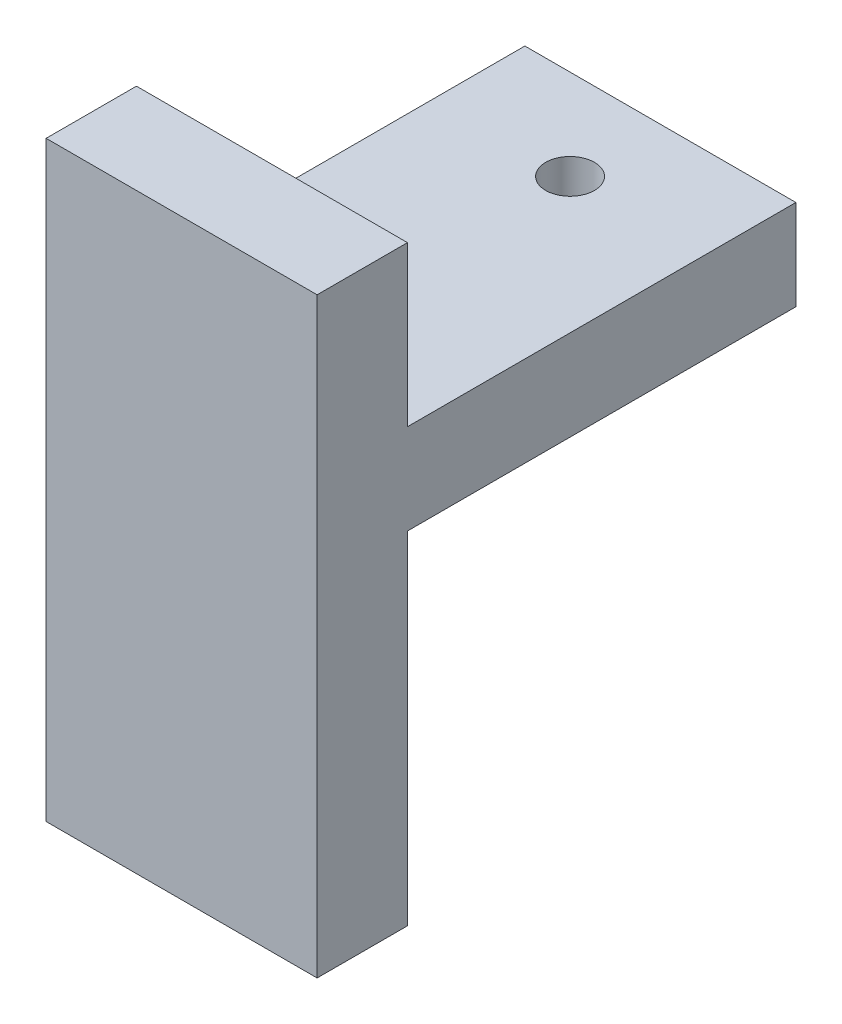
ISO-10303-21;
HEADER;
FILE_DESCRIPTION(('STEP AP214'),'2;1');
FILE_NAME('part.step','',(''),(''),'','','');
FILE_SCHEMA(('AUTOMOTIVE_DESIGN { 1 0 10303 214 1 1 1 1 }'));
ENDSEC;
DATA;
#1=APPLICATION_CONTEXT('core data for automotive mechanical design processes');
#2=APPLICATION_PROTOCOL_DEFINITION('international standard','automotive_design',2000,#1);
#3=PRODUCT_CONTEXT('',#1,'mechanical');
#4=PRODUCT('Part','Part','',(#3));
#5=PRODUCT_RELATED_PRODUCT_CATEGORY('part','',(#4));
#6=PRODUCT_DEFINITION_FORMATION('','',#4);
#7=PRODUCT_DEFINITION_CONTEXT('part definition',#1,'design');
#8=PRODUCT_DEFINITION('design','',#6,#7);
#9=PRODUCT_DEFINITION_SHAPE('','',#8);
#10=(LENGTH_UNIT() NAMED_UNIT(*) SI_UNIT(.MILLI.,.METRE.));
#11=(NAMED_UNIT(*) PLANE_ANGLE_UNIT() SI_UNIT($,.RADIAN.));
#12=(NAMED_UNIT(*) SI_UNIT($,.STERADIAN.) SOLID_ANGLE_UNIT());
#13=UNCERTAINTY_MEASURE_WITH_UNIT(LENGTH_MEASURE(1.E-05),#10,'distance_accuracy_value','');
#14=(GEOMETRIC_REPRESENTATION_CONTEXT(3) GLOBAL_UNCERTAINTY_ASSIGNED_CONTEXT((#13)) GLOBAL_UNIT_ASSIGNED_CONTEXT((#10,
#11,#12)) REPRESENTATION_CONTEXT('',''));
#15=CARTESIAN_POINT('',(0.,0.,0.));
#16=DIRECTION('',(0.,0.,1.));
#17=DIRECTION('',(1.,0.,0.));
#18=AXIS2_PLACEMENT_3D('',#15,#16,#17);
#19=CARTESIAN_POINT('',(0.,10.,0.));
#20=DIRECTION('',(0.,-1.,0.));
#21=DIRECTION('',(0.,0.,-1.));
#22=AXIS2_PLACEMENT_3D('',#19,#20,#21);
#23=PLANE('',#22);
#24=CARTESIAN_POINT('',(0.,10.,-16.5));
#25=DIRECTION('',(0.,1.,0.));
#26=DIRECTION('',(0.,0.,1.));
#27=AXIS2_PLACEMENT_3D('',#24,#25,#26);
#28=CIRCLE('',#27,2.7);
#29=CARTESIAN_POINT('',(0.,10.,-13.8));
#30=VERTEX_POINT('',#29);
#31=EDGE_CURVE('E149',#30,#30,#28,.T.);
#32=ORIENTED_EDGE('',*,*,#31,.F.);
#33=EDGE_LOOP('',(#32));
#34=FACE_BOUND('',#33,.T.);
#35=DIRECTION('',(-1.,0.,0.));
#36=VECTOR('',#35,1.);
#37=CARTESIAN_POINT('',(15.,10.,16.5));
#38=LINE('',#37,#36);
#39=CARTESIAN_POINT('',(15.,10.,16.5));
#40=VERTEX_POINT('',#39);
#41=CARTESIAN_POINT('',(-15.,10.,16.5));
#42=VERTEX_POINT('',#41);
#43=EDGE_CURVE('E60',#40,#42,#38,.T.);
#44=ORIENTED_EDGE('',*,*,#43,.F.);
#45=DIRECTION('',(0.,0.,-1.));
#46=VECTOR('',#45,1.);
#47=CARTESIAN_POINT('',(15.,10.,26.5));
#48=LINE('',#47,#46);
#49=CARTESIAN_POINT('',(15.,10.,-26.5));
#50=VERTEX_POINT('',#49);
#51=EDGE_CURVE('E155',#40,#50,#48,.T.);
#52=ORIENTED_EDGE('',*,*,#51,.T.);
#53=DIRECTION('',(-1.,0.,0.));
#54=VECTOR('',#53,1.);
#55=CARTESIAN_POINT('',(-15.,10.,-26.5));
#56=LINE('',#55,#54);
#57=CARTESIAN_POINT('',(-15.,10.,-26.5));
#58=VERTEX_POINT('',#57);
#59=EDGE_CURVE('E157',#50,#58,#56,.T.);
#60=ORIENTED_EDGE('',*,*,#59,.T.);
#61=DIRECTION('',(0.,0.,1.));
#62=VECTOR('',#61,1.);
#63=CARTESIAN_POINT('',(-15.,10.,26.5));
#64=LINE('',#63,#62);
#65=EDGE_CURVE('E159',#58,#42,#64,.T.);
#66=ORIENTED_EDGE('',*,*,#65,.T.);
#67=EDGE_LOOP('',(#44,#52,#60,#66));
#68=FACE_BOUND('',#67,.T.);
#69=ADVANCED_FACE('F37',(#34,#68),#23,.F.);
#70=CARTESIAN_POINT('',(0.,0.,0.));
#71=DIRECTION('',(0.,-1.,0.));
#72=DIRECTION('',(0.,0.,-1.));
#73=AXIS2_PLACEMENT_3D('',#70,#71,#72);
#74=PLANE('',#73);
#75=DIRECTION('',(1.,0.,0.));
#76=VECTOR('',#75,1.);
#77=CARTESIAN_POINT('',(-15.,0.,16.5));
#78=LINE('',#77,#76);
#79=CARTESIAN_POINT('',(-15.,0.,16.5));
#80=VERTEX_POINT('',#79);
#81=CARTESIAN_POINT('',(15.,0.,16.5));
#82=VERTEX_POINT('',#81);
#83=EDGE_CURVE('E52',#80,#82,#78,.T.);
#84=ORIENTED_EDGE('',*,*,#83,.F.);
#85=DIRECTION('',(0.,0.,1.));
#86=VECTOR('',#85,1.);
#87=CARTESIAN_POINT('',(-15.,0.,26.5));
#88=LINE('',#87,#86);
#89=CARTESIAN_POINT('',(-15.,0.,-26.5));
#90=VERTEX_POINT('',#89);
#91=EDGE_CURVE('E125',#90,#80,#88,.T.);
#92=ORIENTED_EDGE('',*,*,#91,.F.);
#93=DIRECTION('',(-1.,0.,0.));
#94=VECTOR('',#93,1.);
#95=CARTESIAN_POINT('',(-15.,0.,-26.5));
#96=LINE('',#95,#94);
#97=CARTESIAN_POINT('',(15.,0.,-26.5));
#98=VERTEX_POINT('',#97);
#99=EDGE_CURVE('E163',#98,#90,#96,.T.);
#100=ORIENTED_EDGE('',*,*,#99,.F.);
#101=DIRECTION('',(0.,0.,-1.));
#102=VECTOR('',#101,1.);
#103=CARTESIAN_POINT('',(15.,0.,26.5));
#104=LINE('',#103,#102);
#105=EDGE_CURVE('E152',#82,#98,#104,.T.);
#106=ORIENTED_EDGE('',*,*,#105,.F.);
#107=EDGE_LOOP('',(#84,#92,#100,#106));
#108=FACE_BOUND('',#107,.T.);
#109=CARTESIAN_POINT('',(0.,0.,-16.5));
#110=DIRECTION('',(0.,1.,0.));
#111=DIRECTION('',(0.,0.,1.));
#112=AXIS2_PLACEMENT_3D('',#109,#110,#111);
#113=CIRCLE('',#112,2.7);
#114=CARTESIAN_POINT('',(0.,0.,-13.8));
#115=VERTEX_POINT('',#114);
#116=EDGE_CURVE('E148',#115,#115,#113,.T.);
#117=ORIENTED_EDGE('',*,*,#116,.T.);
#118=EDGE_LOOP('',(#117));
#119=FACE_BOUND('',#118,.T.);
#120=ADVANCED_FACE('F173',(#108,#119),#74,.T.);
#121=CARTESIAN_POINT('',(15.,10.,26.5));
#122=DIRECTION('',(-1.,0.,0.));
#123=DIRECTION('',(0.,0.,1.));
#124=AXIS2_PLACEMENT_3D('',#121,#122,#123);
#125=PLANE('',#124);
#126=DIRECTION('',(0.,-1.,0.));
#127=VECTOR('',#126,1.);
#128=CARTESIAN_POINT('',(15.,10.,26.5));
#129=LINE('',#128,#127);
#130=CARTESIAN_POINT('',(15.,27.65,26.5));
#131=VERTEX_POINT('',#130);
#132=CARTESIAN_POINT('',(15.,-37.85,26.5));
#133=VERTEX_POINT('',#132);
#134=EDGE_CURVE('E161',#131,#133,#129,.T.);
#135=ORIENTED_EDGE('',*,*,#134,.T.);
#136=DIRECTION('',(0.,0.,1.));
#137=VECTOR('',#136,1.);
#138=CARTESIAN_POINT('',(15.,-37.85,26.5));
#139=LINE('',#138,#137);
#140=CARTESIAN_POINT('',(15.,-37.85,16.5));
#141=VERTEX_POINT('',#140);
#142=EDGE_CURVE('E113',#141,#133,#139,.T.);
#143=ORIENTED_EDGE('',*,*,#142,.F.);
#144=DIRECTION('',(0.,1.,0.));
#145=VECTOR('',#144,1.);
#146=CARTESIAN_POINT('',(15.,-37.85,16.5));
#147=LINE('',#146,#145);
#148=EDGE_CURVE('E109',#141,#82,#147,.T.);
#149=ORIENTED_EDGE('',*,*,#148,.T.);
#150=ORIENTED_EDGE('',*,*,#105,.T.);
#151=DIRECTION('',(0.,-1.,0.));
#152=VECTOR('',#151,1.);
#153=CARTESIAN_POINT('',(15.,10.,-26.5));
#154=LINE('',#153,#152);
#155=EDGE_CURVE('E11',#50,#98,#154,.T.);
#156=ORIENTED_EDGE('',*,*,#155,.F.);
#157=ORIENTED_EDGE('',*,*,#51,.F.);
#158=DIRECTION('',(0.,-1.,0.));
#159=VECTOR('',#158,1.);
#160=CARTESIAN_POINT('',(15.,27.65,16.5));
#161=LINE('',#160,#159);
#162=CARTESIAN_POINT('',(15.,27.65,16.5));
#163=VERTEX_POINT('',#162);
#164=EDGE_CURVE('E145',#163,#40,#161,.T.);
#165=ORIENTED_EDGE('',*,*,#164,.F.);
#166=DIRECTION('',(0.,0.,-1.));
#167=VECTOR('',#166,1.);
#168=CARTESIAN_POINT('',(15.,27.65,26.5));
#169=LINE('',#168,#167);
#170=EDGE_CURVE('E127',#131,#163,#169,.T.);
#171=ORIENTED_EDGE('',*,*,#170,.F.);
#172=EDGE_LOOP('',(#135,#143,#149,#150,#156,#157,#165,#171));
#173=FACE_BOUND('',#172,.T.);
#174=ADVANCED_FACE('F39',(#173),#125,.F.);
#175=CARTESIAN_POINT('',(-15.,10.,-26.5));
#176=DIRECTION('',(0.,0.,1.));
#177=DIRECTION('',(1.,0.,0.));
#178=AXIS2_PLACEMENT_3D('',#175,#176,#177);
#179=PLANE('',#178);
#180=ORIENTED_EDGE('',*,*,#99,.T.);
#181=DIRECTION('',(0.,-1.,0.));
#182=VECTOR('',#181,1.);
#183=CARTESIAN_POINT('',(-15.,10.,-26.5));
#184=LINE('',#183,#182);
#185=EDGE_CURVE('E45',#58,#90,#184,.T.);
#186=ORIENTED_EDGE('',*,*,#185,.F.);
#187=ORIENTED_EDGE('',*,*,#59,.F.);
#188=ORIENTED_EDGE('',*,*,#155,.T.);
#189=EDGE_LOOP('',(#180,#186,#187,#188));
#190=FACE_BOUND('',#189,.T.);
#191=ADVANCED_FACE('F176',(#190),#179,.F.);
#192=CARTESIAN_POINT('',(-15.,10.,26.5));
#193=DIRECTION('',(1.,0.,0.));
#194=DIRECTION('',(0.,0.,-1.));
#195=AXIS2_PLACEMENT_3D('',#192,#193,#194);
#196=PLANE('',#195);
#197=ORIENTED_EDGE('',*,*,#91,.T.);
#198=DIRECTION('',(0.,1.,0.));
#199=VECTOR('',#198,1.);
#200=CARTESIAN_POINT('',(-15.,-37.85,16.5));
#201=LINE('',#200,#199);
#202=CARTESIAN_POINT('',(-15.,-37.85,16.5));
#203=VERTEX_POINT('',#202);
#204=EDGE_CURVE('E107',#203,#80,#201,.T.);
#205=ORIENTED_EDGE('',*,*,#204,.F.);
#206=DIRECTION('',(0.,0.,-1.));
#207=VECTOR('',#206,1.);
#208=CARTESIAN_POINT('',(-15.,-37.85,26.5));
#209=LINE('',#208,#207);
#210=CARTESIAN_POINT('',(-15.,-37.85,26.5));
#211=VERTEX_POINT('',#210);
#212=EDGE_CURVE('E114',#211,#203,#209,.T.);
#213=ORIENTED_EDGE('',*,*,#212,.F.);
#214=DIRECTION('',(0.,-1.,0.));
#215=VECTOR('',#214,1.);
#216=CARTESIAN_POINT('',(-15.,10.,26.5));
#217=LINE('',#216,#215);
#218=CARTESIAN_POINT('',(-15.,27.65,26.5));
#219=VERTEX_POINT('',#218);
#220=EDGE_CURVE('E167',#219,#211,#217,.T.);
#221=ORIENTED_EDGE('',*,*,#220,.F.);
#222=DIRECTION('',(0.,0.,1.));
#223=VECTOR('',#222,1.);
#224=CARTESIAN_POINT('',(-15.,27.65,26.5));
#225=LINE('',#224,#223);
#226=CARTESIAN_POINT('',(-15.,27.65,16.5));
#227=VERTEX_POINT('',#226);
#228=EDGE_CURVE('E136',#227,#219,#225,.T.);
#229=ORIENTED_EDGE('',*,*,#228,.F.);
#230=DIRECTION('',(0.,-1.,0.));
#231=VECTOR('',#230,1.);
#232=CARTESIAN_POINT('',(-15.,27.65,16.5));
#233=LINE('',#232,#231);
#234=EDGE_CURVE('E141',#227,#42,#233,.T.);
#235=ORIENTED_EDGE('',*,*,#234,.T.);
#236=ORIENTED_EDGE('',*,*,#65,.F.);
#237=ORIENTED_EDGE('',*,*,#185,.T.);
#238=EDGE_LOOP('',(#197,#205,#213,#221,#229,#235,#236,#237));
#239=FACE_BOUND('',#238,.T.);
#240=ADVANCED_FACE('F123',(#239),#196,.F.);
#241=CARTESIAN_POINT('',(-15.,10.,26.5));
#242=DIRECTION('',(0.,0.,-1.));
#243=DIRECTION('',(-1.,0.,0.));
#244=AXIS2_PLACEMENT_3D('',#241,#242,#243);
#245=PLANE('',#244);
#246=ORIENTED_EDGE('',*,*,#220,.T.);
#247=DIRECTION('',(-1.,0.,0.));
#248=VECTOR('',#247,1.);
#249=CARTESIAN_POINT('',(-15.,-37.85,26.5));
#250=LINE('',#249,#248);
#251=EDGE_CURVE('E120',#133,#211,#250,.T.);
#252=ORIENTED_EDGE('',*,*,#251,.F.);
#253=ORIENTED_EDGE('',*,*,#134,.F.);
#254=DIRECTION('',(1.,0.,0.));
#255=VECTOR('',#254,1.);
#256=CARTESIAN_POINT('',(15.,27.65,26.5));
#257=LINE('',#256,#255);
#258=EDGE_CURVE('E139',#219,#131,#257,.T.);
#259=ORIENTED_EDGE('',*,*,#258,.F.);
#260=EDGE_LOOP('',(#246,#252,#253,#259));
#261=FACE_BOUND('',#260,.T.);
#262=ADVANCED_FACE('F183',(#261),#245,.F.);
#263=CARTESIAN_POINT('',(0.,10.,-16.5));
#264=DIRECTION('',(0.,-1.,0.));
#265=DIRECTION('',(0.,0.,-1.));
#266=AXIS2_PLACEMENT_3D('',#263,#264,#265);
#267=CYLINDRICAL_SURFACE('',#266,2.7);
#268=ORIENTED_EDGE('',*,*,#31,.T.);
#269=EDGE_LOOP('',(#268));
#270=FACE_BOUND('',#269,.T.);
#271=ORIENTED_EDGE('',*,*,#116,.F.);
#272=EDGE_LOOP('',(#271));
#273=FACE_BOUND('',#272,.T.);
#274=ADVANCED_FACE('F192',(#270,#273),#267,.F.);
#275=CARTESIAN_POINT('',(15.,27.65,16.5));
#276=DIRECTION('',(0.,0.,1.));
#277=DIRECTION('',(1.,0.,0.));
#278=AXIS2_PLACEMENT_3D('',#275,#276,#277);
#279=PLANE('',#278);
#280=ORIENTED_EDGE('',*,*,#43,.T.);
#281=ORIENTED_EDGE('',*,*,#234,.F.);
#282=DIRECTION('',(-1.,0.,0.));
#283=VECTOR('',#282,1.);
#284=CARTESIAN_POINT('',(15.,27.65,16.5));
#285=LINE('',#284,#283);
#286=EDGE_CURVE('E134',#163,#227,#285,.T.);
#287=ORIENTED_EDGE('',*,*,#286,.F.);
#288=ORIENTED_EDGE('',*,*,#164,.T.);
#289=EDGE_LOOP('',(#280,#281,#287,#288));
#290=FACE_BOUND('',#289,.T.);
#291=ADVANCED_FACE('F190',(#290),#279,.F.);
#292=CARTESIAN_POINT('',(0.,27.65,0.));
#293=DIRECTION('',(0.,1.,0.));
#294=DIRECTION('',(0.,0.,1.));
#295=AXIS2_PLACEMENT_3D('',#292,#293,#294);
#296=PLANE('',#295);
#297=ORIENTED_EDGE('',*,*,#170,.T.);
#298=ORIENTED_EDGE('',*,*,#286,.T.);
#299=ORIENTED_EDGE('',*,*,#228,.T.);
#300=ORIENTED_EDGE('',*,*,#258,.T.);
#301=EDGE_LOOP('',(#297,#298,#299,#300));
#302=FACE_BOUND('',#301,.T.);
#303=ADVANCED_FACE('F187',(#302),#296,.T.);
#304=CARTESIAN_POINT('',(-15.,-37.85,16.5));
#305=DIRECTION('',(0.,0.,1.));
#306=DIRECTION('',(1.,0.,0.));
#307=AXIS2_PLACEMENT_3D('',#304,#305,#306);
#308=PLANE('',#307);
#309=ORIENTED_EDGE('',*,*,#83,.T.);
#310=ORIENTED_EDGE('',*,*,#148,.F.);
#311=DIRECTION('',(1.,0.,0.));
#312=VECTOR('',#311,1.);
#313=CARTESIAN_POINT('',(-15.,-37.85,16.5));
#314=LINE('',#313,#312);
#315=EDGE_CURVE('E103',#203,#141,#314,.T.);
#316=ORIENTED_EDGE('',*,*,#315,.F.);
#317=ORIENTED_EDGE('',*,*,#204,.T.);
#318=EDGE_LOOP('',(#309,#310,#316,#317));
#319=FACE_BOUND('',#318,.T.);
#320=ADVANCED_FACE('F105',(#319),#308,.F.);
#321=CARTESIAN_POINT('',(0.,-37.85,0.));
#322=DIRECTION('',(0.,-1.,0.));
#323=DIRECTION('',(0.,0.,-1.));
#324=AXIS2_PLACEMENT_3D('',#321,#322,#323);
#325=PLANE('',#324);
#326=ORIENTED_EDGE('',*,*,#212,.T.);
#327=ORIENTED_EDGE('',*,*,#315,.T.);
#328=ORIENTED_EDGE('',*,*,#142,.T.);
#329=ORIENTED_EDGE('',*,*,#251,.T.);
#330=EDGE_LOOP('',(#326,#327,#328,#329));
#331=FACE_BOUND('',#330,.T.);
#332=ADVANCED_FACE('F118',(#331),#325,.T.);
#333=CLOSED_SHELL('',(#69,#120,#174,#191,#240,#262,#274,#291,#303,#320,#332));
#334=MANIFOLD_SOLID_BREP('B2',#333);
#335=ADVANCED_BREP_SHAPE_REPRESENTATION('',(#18,#334),#14);
#336=SHAPE_DEFINITION_REPRESENTATION(#9,#335);
ENDSEC;
END-ISO-10303-21;
